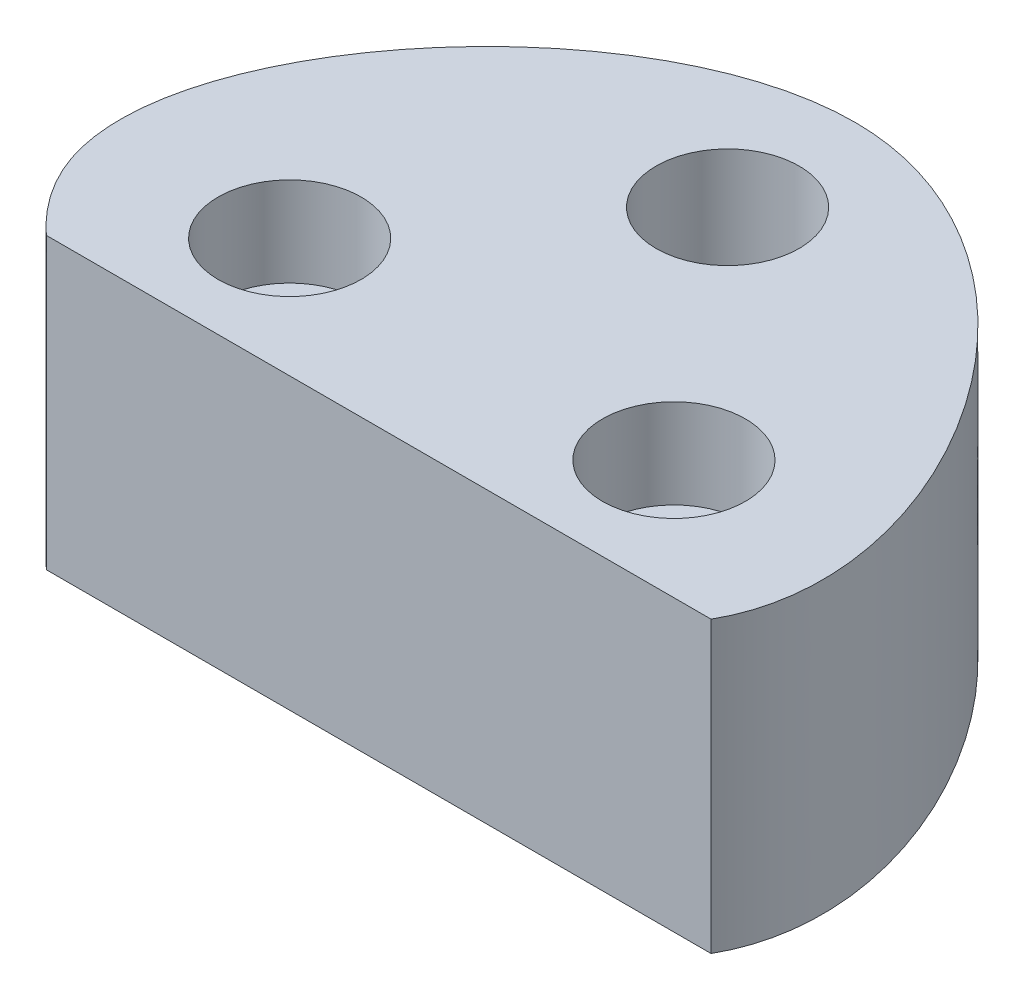
ISO-10303-21;
HEADER;
FILE_DESCRIPTION(('STEP AP214'),'2;1');
FILE_NAME('part.step','',(''),(''),'','','');
FILE_SCHEMA(('AUTOMOTIVE_DESIGN { 1 0 10303 214 1 1 1 1 }'));
ENDSEC;
DATA;
#1=APPLICATION_CONTEXT('core data for automotive mechanical design processes');
#2=APPLICATION_PROTOCOL_DEFINITION('international standard','automotive_design',2000,#1);
#3=PRODUCT_CONTEXT('',#1,'mechanical');
#4=PRODUCT('Part','Part','',(#3));
#5=PRODUCT_RELATED_PRODUCT_CATEGORY('part','',(#4));
#6=PRODUCT_DEFINITION_FORMATION('','',#4);
#7=PRODUCT_DEFINITION_CONTEXT('part definition',#1,'design');
#8=PRODUCT_DEFINITION('design','',#6,#7);
#9=PRODUCT_DEFINITION_SHAPE('','',#8);
#10=(LENGTH_UNIT() NAMED_UNIT(*) SI_UNIT(.MILLI.,.METRE.));
#11=(NAMED_UNIT(*) PLANE_ANGLE_UNIT() SI_UNIT($,.RADIAN.));
#12=(NAMED_UNIT(*) SI_UNIT($,.STERADIAN.) SOLID_ANGLE_UNIT());
#13=UNCERTAINTY_MEASURE_WITH_UNIT(LENGTH_MEASURE(1.E-05),#10,'distance_accuracy_value','');
#14=(GEOMETRIC_REPRESENTATION_CONTEXT(3) GLOBAL_UNCERTAINTY_ASSIGNED_CONTEXT((#13)) GLOBAL_UNIT_ASSIGNED_CONTEXT((#10,
#11,#12)) REPRESENTATION_CONTEXT('',''));
#15=CARTESIAN_POINT('',(0.,0.,0.));
#16=DIRECTION('',(0.,0.,1.));
#17=DIRECTION('',(1.,0.,0.));
#18=AXIS2_PLACEMENT_3D('',#15,#16,#17);
#19=CARTESIAN_POINT('',(0.,16.2,0.));
#20=DIRECTION('',(0.,1.,0.));
#21=DIRECTION('',(0.,0.,1.));
#22=AXIS2_PLACEMENT_3D('',#19,#20,#21);
#23=PLANE('',#22);
#24=CARTESIAN_POINT('',(-10.75,16.2,13.75));
#25=DIRECTION('',(0.,1.,0.));
#26=DIRECTION('',(0.,0.,1.));
#27=AXIS2_PLACEMENT_3D('',#24,#25,#26);
#28=CIRCLE('',#27,4.);
#29=CARTESIAN_POINT('',(-10.75,16.2,17.75));
#30=VERTEX_POINT('',#29);
#31=EDGE_CURVE('E114',#30,#30,#28,.T.);
#32=ORIENTED_EDGE('',*,*,#31,.F.);
#33=EDGE_LOOP('',(#32));
#34=FACE_BOUND('',#33,.T.);
#35=CARTESIAN_POINT('',(10.75,16.2,13.75));
#36=DIRECTION('',(0.,-1.,0.));
#37=DIRECTION('',(0.,0.,1.));
#38=AXIS2_PLACEMENT_3D('',#35,#36,#37);
#39=CIRCLE('',#38,4.);
#40=CARTESIAN_POINT('',(10.75,16.2,17.75));
#41=VERTEX_POINT('',#40);
#42=EDGE_CURVE('E113',#41,#41,#39,.T.);
#43=ORIENTED_EDGE('',*,*,#42,.T.);
#44=EDGE_LOOP('',(#43));
#45=FACE_BOUND('',#44,.T.);
#46=CARTESIAN_POINT('',(0.,16.2,0.));
#47=DIRECTION('',(0.,1.,0.));
#48=DIRECTION('',(0.,0.,1.));
#49=AXIS2_PLACEMENT_3D('',#46,#47,#48);
#50=CIRCLE('',#49,4.);
#51=CARTESIAN_POINT('',(0.,16.2,4.));
#52=VERTEX_POINT('',#51);
#53=EDGE_CURVE('E84',#52,#52,#50,.T.);
#54=ORIENTED_EDGE('',*,*,#53,.F.);
#55=EDGE_LOOP('',(#54));
#56=FACE_BOUND('',#55,.T.);
#57=CARTESIAN_POINT('',(0.,16.2,-7.67151072619957));
#58=CARTESIAN_POINT('',(-11.6762197540645,16.2,-8.15890811091288));
#59=CARTESIAN_POINT('',(-39.7975653135726,16.2,25.7540339386395));
#60=CARTESIAN_POINT('',(38.7332011982261,16.2,33.4890601476254));
#61=CARTESIAN_POINT('',(12.6814987216598,16.2,-7.14215024469352));
#62=CARTESIAN_POINT('',(0.,16.2,-7.67151072619957));
#63=B_SPLINE_CURVE_WITH_KNOTS('',3,(#57,#58,#59,#60,#61,#62),.UNSPECIFIED.,.T.,.F.,(4,1,1,4),
(0.,0.296673026076799,0.677784532992004,1.),.UNSPECIFIED.);
#64=CARTESIAN_POINT('',(19.4913782644413,16.2,20.4169968330856));
#65=VERTEX_POINT('',#64);
#66=CARTESIAN_POINT('',(-17.695652793406,16.2,20.4169968330856));
#67=VERTEX_POINT('',#66);
#68=EDGE_CURVE('E88',#65,#67,#63,.T.);
#69=ORIENTED_EDGE('',*,*,#68,.T.);
#70=DIRECTION('',(1.,0.,0.));
#71=VECTOR('',#70,1.);
#72=CARTESIAN_POINT('',(0.,16.2,20.4169968330856));
#73=LINE('',#72,#71);
#74=EDGE_CURVE('E80',#67,#65,#73,.T.);
#75=ORIENTED_EDGE('',*,*,#74,.T.);
#76=EDGE_LOOP('',(#69,#75));
#77=FACE_BOUND('',#76,.T.);
#78=ADVANCED_FACE('F48',(#34,#45,#56,#77),#23,.T.);
#79=CARTESIAN_POINT('',(0.,0.,0.));
#80=DIRECTION('',(0.,1.,0.));
#81=DIRECTION('',(0.,0.,1.));
#82=AXIS2_PLACEMENT_3D('',#79,#80,#81);
#83=PLANE('',#82);
#84=CARTESIAN_POINT('',(0.,0.,0.));
#85=DIRECTION('',(0.,1.,0.));
#86=DIRECTION('',(0.,0.,1.));
#87=AXIS2_PLACEMENT_3D('',#84,#85,#86);
#88=CIRCLE('',#87,4.);
#89=CARTESIAN_POINT('',(0.,0.,4.));
#90=VERTEX_POINT('',#89);
#91=EDGE_CURVE('E110',#90,#90,#88,.T.);
#92=ORIENTED_EDGE('',*,*,#91,.T.);
#93=EDGE_LOOP('',(#92));
#94=FACE_BOUND('',#93,.T.);
#95=DIRECTION('',(1.,0.,0.));
#96=VECTOR('',#95,1.);
#97=CARTESIAN_POINT('',(0.,0.,20.4169968330856));
#98=LINE('',#97,#96);
#99=CARTESIAN_POINT('',(-17.695652793406,0.,20.4169968330856));
#100=VERTEX_POINT('',#99);
#101=CARTESIAN_POINT('',(19.4913782644413,0.,20.4169968330856));
#102=VERTEX_POINT('',#101);
#103=EDGE_CURVE('E67',#100,#102,#98,.T.);
#104=ORIENTED_EDGE('',*,*,#103,.F.);
#105=CARTESIAN_POINT('',(0.,0.,-7.67151072619957));
#106=CARTESIAN_POINT('',(-11.6762197540645,0.,-8.15890811091288));
#107=CARTESIAN_POINT('',(-39.7975653135726,0.,25.7540339386395));
#108=CARTESIAN_POINT('',(38.7332011982261,0.,33.4890601476254));
#109=CARTESIAN_POINT('',(12.6814987216598,0.,-7.14215024469352));
#110=CARTESIAN_POINT('',(0.,0.,-7.67151072619957));
#111=B_SPLINE_CURVE_WITH_KNOTS('',3,(#105,#106,#107,#108,#109,#110),.UNSPECIFIED.,.T.,.F.,(4,1,
1,4),(0.,0.296673026076799,0.677784532992004,1.),.UNSPECIFIED.);
#112=EDGE_CURVE('E12',#102,#100,#111,.T.);
#113=ORIENTED_EDGE('',*,*,#112,.F.);
#114=EDGE_LOOP('',(#104,#113));
#115=FACE_BOUND('',#114,.T.);
#116=ADVANCED_FACE('F50',(#94,#115),#83,.F.);
#117=CARTESIAN_POINT('',(-10.75,11.2,13.75));
#118=DIRECTION('',(0.,1.,0.));
#119=DIRECTION('',(0.,0.,1.));
#120=AXIS2_PLACEMENT_3D('',#117,#118,#119);
#121=CYLINDRICAL_SURFACE('',#120,4.);
#122=CARTESIAN_POINT('',(-10.75,11.2,13.75));
#123=DIRECTION('',(0.,1.,0.));
#124=DIRECTION('',(0.,0.,1.));
#125=AXIS2_PLACEMENT_3D('',#122,#123,#124);
#126=CIRCLE('',#125,4.);
#127=CARTESIAN_POINT('',(-10.75,11.2,17.75));
#128=VERTEX_POINT('',#127);
#129=EDGE_CURVE('E59',#128,#128,#126,.T.);
#130=ORIENTED_EDGE('',*,*,#129,.F.);
#131=EDGE_LOOP('',(#130));
#132=FACE_BOUND('',#131,.T.);
#133=ORIENTED_EDGE('',*,*,#31,.T.);
#134=EDGE_LOOP('',(#133));
#135=FACE_BOUND('',#134,.T.);
#136=ADVANCED_FACE('F154',(#132,#135),#121,.F.);
#137=CARTESIAN_POINT('',(-10.75,11.2,13.75));
#138=DIRECTION('',(0.,1.,0.));
#139=DIRECTION('',(0.,0.,1.));
#140=AXIS2_PLACEMENT_3D('',#137,#138,#139);
#141=PLANE('',#140);
#142=ORIENTED_EDGE('',*,*,#129,.T.);
#143=EDGE_LOOP('',(#142));
#144=FACE_BOUND('',#143,.T.);
#145=ADVANCED_FACE('F150',(#144),#141,.T.);
#146=CARTESIAN_POINT('',(10.75,11.2,13.75));
#147=DIRECTION('',(0.,1.,0.));
#148=DIRECTION('',(0.,0.,1.));
#149=AXIS2_PLACEMENT_3D('',#146,#147,#148);
#150=CYLINDRICAL_SURFACE('',#149,4.);
#151=CARTESIAN_POINT('',(10.75,11.2,13.75));
#152=DIRECTION('',(0.,-1.,0.));
#153=DIRECTION('',(0.,0.,1.));
#154=AXIS2_PLACEMENT_3D('',#151,#152,#153);
#155=CIRCLE('',#154,4.);
#156=CARTESIAN_POINT('',(10.75,11.2,17.75));
#157=VERTEX_POINT('',#156);
#158=EDGE_CURVE('E117',#157,#157,#155,.T.);
#159=ORIENTED_EDGE('',*,*,#158,.T.);
#160=EDGE_LOOP('',(#159));
#161=FACE_BOUND('',#160,.T.);
#162=ORIENTED_EDGE('',*,*,#42,.F.);
#163=EDGE_LOOP('',(#162));
#164=FACE_BOUND('',#163,.T.);
#165=ADVANCED_FACE('F146',(#161,#164),#150,.F.);
#166=CARTESIAN_POINT('',(10.75,11.2,13.75));
#167=DIRECTION('',(0.,1.,0.));
#168=DIRECTION('',(0.,0.,1.));
#169=AXIS2_PLACEMENT_3D('',#166,#167,#168);
#170=PLANE('',#169);
#171=ORIENTED_EDGE('',*,*,#158,.F.);
#172=EDGE_LOOP('',(#171));
#173=FACE_BOUND('',#172,.T.);
#174=ADVANCED_FACE('F142',(#173),#170,.T.);
#175=CARTESIAN_POINT('',(0.,-1.8,0.));
#176=DIRECTION('',(0.,1.,0.));
#177=DIRECTION('',(0.,0.,1.));
#178=AXIS2_PLACEMENT_3D('',#175,#176,#177);
#179=CYLINDRICAL_SURFACE('',#178,4.);
#180=ORIENTED_EDGE('',*,*,#53,.T.);
#181=EDGE_LOOP('',(#180));
#182=FACE_BOUND('',#181,.T.);
#183=ORIENTED_EDGE('',*,*,#91,.F.);
#184=EDGE_LOOP('',(#183));
#185=FACE_BOUND('',#184,.T.);
#186=ADVANCED_FACE('F138',(#182,#185),#179,.F.);
#187=CARTESIAN_POINT('',(0.,-3.8,-7.67151072619957));
#188=CARTESIAN_POINT('',(-11.6762197540645,-3.8,-8.15890811091288));
#189=CARTESIAN_POINT('',(-39.7975653135726,-3.8,25.7540339386395));
#190=CARTESIAN_POINT('',(38.7332011982261,-3.8,33.4890601476254));
#191=CARTESIAN_POINT('',(12.6814987216598,-3.8,-7.14215024469352));
#192=CARTESIAN_POINT('',(0.,-3.8,-7.67151072619957));
#193=B_SPLINE_CURVE_WITH_KNOTS('',3,(#187,#188,#189,#190,#191,#192),.UNSPECIFIED.,.T.,.F.,(4,1,
1,4),(0.,0.296673026076799,0.677784532992004,1.),.UNSPECIFIED.);
#194=DIRECTION('',(0.,1.,0.));
#195=VECTOR('',#194,1.);
#196=SURFACE_OF_LINEAR_EXTRUSION('',#193,#195);
#197=ORIENTED_EDGE('',*,*,#112,.T.);
#198=CARTESIAN_POINT('',(-17.695652793408,0.,20.4169968330878));
#199=DIRECTION('',(0.,1.,0.));
#200=VECTOR('',#199,1.);
#201=LINE('',#198,#200);
#202=EDGE_CURVE('E72',#100,#67,#201,.T.);
#203=ORIENTED_EDGE('',*,*,#202,.T.);
#204=ORIENTED_EDGE('',*,*,#68,.F.);
#205=DIRECTION('',(0.,1.,0.));
#206=VECTOR('',#205,1.);
#207=CARTESIAN_POINT('',(19.4913782644413,-3.8,20.4169968330856));
#208=LINE('',#207,#206);
#209=EDGE_CURVE('E77',#102,#65,#208,.T.);
#210=ORIENTED_EDGE('',*,*,#209,.F.);
#211=EDGE_LOOP('',(#197,#203,#204,#210));
#212=FACE_BOUND('',#211,.T.);
#213=ADVANCED_FACE('F90',(#212),#196,.T.);
#214=CARTESIAN_POINT('',(0.,-3.8,20.4169968330856));
#215=DIRECTION('',(0.,0.,1.));
#216=DIRECTION('',(1.,0.,0.));
#217=AXIS2_PLACEMENT_3D('',#214,#215,#216);
#218=PLANE('',#217);
#219=ORIENTED_EDGE('',*,*,#103,.T.);
#220=ORIENTED_EDGE('',*,*,#209,.T.);
#221=ORIENTED_EDGE('',*,*,#74,.F.);
#222=ORIENTED_EDGE('',*,*,#202,.F.);
#223=EDGE_LOOP('',(#219,#220,#221,#222));
#224=FACE_BOUND('',#223,.T.);
#225=ADVANCED_FACE('F79',(#224),#218,.T.);
#226=CLOSED_SHELL('',(#78,#116,#136,#145,#165,#174,#186,#213,#225));
#227=MANIFOLD_SOLID_BREP('B2',#226);
#228=ADVANCED_BREP_SHAPE_REPRESENTATION('',(#18,#227),#14);
#229=SHAPE_DEFINITION_REPRESENTATION(#9,#228);
ENDSEC;
END-ISO-10303-21;
